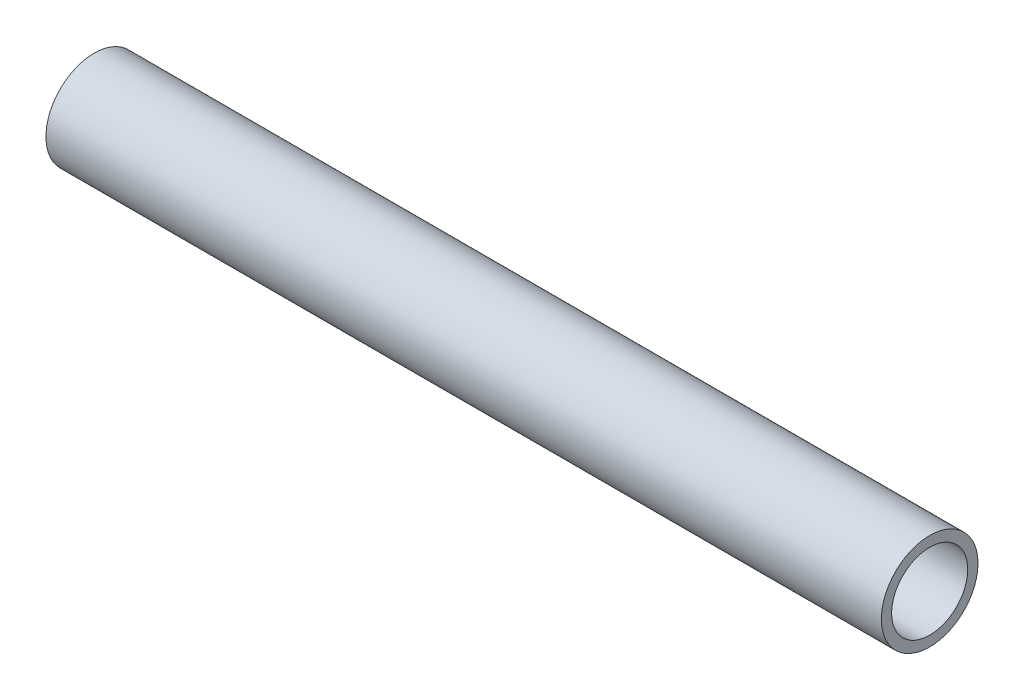
ISO-10303-21;
HEADER;
FILE_DESCRIPTION(('STEP AP214'),'2;1');
FILE_NAME('part.step','',(''),(''),'','','');
FILE_SCHEMA(('AUTOMOTIVE_DESIGN { 1 0 10303 214 1 1 1 1 }'));
ENDSEC;
DATA;
#1=APPLICATION_CONTEXT('core data for automotive mechanical design processes');
#2=APPLICATION_PROTOCOL_DEFINITION('international standard','automotive_design',2000,#1);
#3=PRODUCT_CONTEXT('',#1,'mechanical');
#4=PRODUCT('Part','Part','',(#3));
#5=PRODUCT_RELATED_PRODUCT_CATEGORY('part','',(#4));
#6=PRODUCT_DEFINITION_FORMATION('','',#4);
#7=PRODUCT_DEFINITION_CONTEXT('part definition',#1,'design');
#8=PRODUCT_DEFINITION('design','',#6,#7);
#9=PRODUCT_DEFINITION_SHAPE('','',#8);
#10=(LENGTH_UNIT() NAMED_UNIT(*) SI_UNIT(.MILLI.,.METRE.));
#11=(NAMED_UNIT(*) PLANE_ANGLE_UNIT() SI_UNIT($,.RADIAN.));
#12=(NAMED_UNIT(*) SI_UNIT($,.STERADIAN.) SOLID_ANGLE_UNIT());
#13=UNCERTAINTY_MEASURE_WITH_UNIT(LENGTH_MEASURE(1.E-05),#10,'distance_accuracy_value','');
#14=(GEOMETRIC_REPRESENTATION_CONTEXT(3) GLOBAL_UNCERTAINTY_ASSIGNED_CONTEXT((#13)) GLOBAL_UNIT_ASSIGNED_CONTEXT((#10,
#11,#12)) REPRESENTATION_CONTEXT('',''));
#15=CARTESIAN_POINT('',(0.,0.,0.));
#16=DIRECTION('',(0.,0.,1.));
#17=DIRECTION('',(1.,0.,0.));
#18=AXIS2_PLACEMENT_3D('',#15,#16,#17);
#19=CARTESIAN_POINT('',(54.356,0.,0.));
#20=DIRECTION('',(1.,0.,0.));
#21=DIRECTION('',(0.,0.,-1.));
#22=AXIS2_PLACEMENT_3D('',#19,#20,#21);
#23=CYLINDRICAL_SURFACE('',#22,2.4765);
#24=CARTESIAN_POINT('',(0.,0.,0.));
#25=DIRECTION('',(1.,0.,0.));
#26=DIRECTION('',(0.,0.,-1.));
#27=AXIS2_PLACEMENT_3D('',#24,#25,#26);
#28=CIRCLE('',#27,2.4765);
#29=CARTESIAN_POINT('',(0.,0.,-2.4765));
#30=VERTEX_POINT('',#29);
#31=EDGE_CURVE('E27',#30,#30,#28,.F.);
#32=ORIENTED_EDGE('',*,*,#31,.T.);
#33=EDGE_LOOP('',(#32));
#34=FACE_BOUND('',#33,.T.);
#35=CARTESIAN_POINT('',(54.356,0.,0.));
#36=DIRECTION('',(1.,0.,0.));
#37=DIRECTION('',(0.,0.,-1.));
#38=AXIS2_PLACEMENT_3D('',#35,#36,#37);
#39=CIRCLE('',#38,2.4765);
#40=CARTESIAN_POINT('',(54.356,0.,-2.4765));
#41=VERTEX_POINT('',#40);
#42=EDGE_CURVE('E18',#41,#41,#39,.F.);
#43=ORIENTED_EDGE('',*,*,#42,.F.);
#44=EDGE_LOOP('',(#43));
#45=FACE_BOUND('',#44,.T.);
#46=ADVANCED_FACE('F15',(#34,#45),#23,.F.);
#47=CARTESIAN_POINT('',(54.356,0.,0.));
#48=DIRECTION('',(1.,0.,0.));
#49=DIRECTION('',(0.,0.,-1.));
#50=AXIS2_PLACEMENT_3D('',#47,#48,#49);
#51=PLANE('',#50);
#52=ORIENTED_EDGE('',*,*,#42,.T.);
#53=EDGE_LOOP('',(#52));
#54=FACE_BOUND('',#53,.T.);
#55=CARTESIAN_POINT('',(54.356,0.,0.));
#56=DIRECTION('',(1.,0.,0.));
#57=DIRECTION('',(0.,0.,-1.));
#58=AXIS2_PLACEMENT_3D('',#55,#56,#57);
#59=CIRCLE('',#58,3.14325);
#60=CARTESIAN_POINT('',(54.356,0.,-3.14325));
#61=VERTEX_POINT('',#60);
#62=EDGE_CURVE('E22',#61,#61,#59,.F.);
#63=ORIENTED_EDGE('',*,*,#62,.F.);
#64=EDGE_LOOP('',(#63));
#65=FACE_BOUND('',#64,.T.);
#66=ADVANCED_FACE('F35',(#54,#65),#51,.T.);
#67=CARTESIAN_POINT('',(0.,0.,0.));
#68=DIRECTION('',(1.,0.,0.));
#69=DIRECTION('',(0.,0.,-1.));
#70=AXIS2_PLACEMENT_3D('',#67,#68,#69);
#71=PLANE('',#70);
#72=ORIENTED_EDGE('',*,*,#31,.F.);
#73=EDGE_LOOP('',(#72));
#74=FACE_BOUND('',#73,.T.);
#75=CARTESIAN_POINT('',(0.,0.,0.));
#76=DIRECTION('',(1.,0.,0.));
#77=DIRECTION('',(0.,0.,-1.));
#78=AXIS2_PLACEMENT_3D('',#75,#76,#77);
#79=CIRCLE('',#78,3.14325);
#80=CARTESIAN_POINT('',(0.,0.,-3.14325));
#81=VERTEX_POINT('',#80);
#82=EDGE_CURVE('E10',#81,#81,#79,.T.);
#83=ORIENTED_EDGE('',*,*,#82,.F.);
#84=EDGE_LOOP('',(#83));
#85=FACE_BOUND('',#84,.T.);
#86=ADVANCED_FACE('F43',(#74,#85),#71,.F.);
#87=CARTESIAN_POINT('',(54.356,0.,0.));
#88=DIRECTION('',(1.,0.,0.));
#89=DIRECTION('',(0.,0.,-1.));
#90=AXIS2_PLACEMENT_3D('',#87,#88,#89);
#91=CYLINDRICAL_SURFACE('',#90,3.14325);
#92=ORIENTED_EDGE('',*,*,#62,.T.);
#93=EDGE_LOOP('',(#92));
#94=FACE_BOUND('',#93,.T.);
#95=ORIENTED_EDGE('',*,*,#82,.T.);
#96=EDGE_LOOP('',(#95));
#97=FACE_BOUND('',#96,.T.);
#98=ADVANCED_FACE('F44',(#94,#97),#91,.T.);
#99=CLOSED_SHELL('',(#46,#66,#86,#98));
#100=MANIFOLD_SOLID_BREP('B1',#99);
#101=ADVANCED_BREP_SHAPE_REPRESENTATION('',(#18,#100),#14);
#102=SHAPE_DEFINITION_REPRESENTATION(#9,#101);
ENDSEC;
END-ISO-10303-21;
